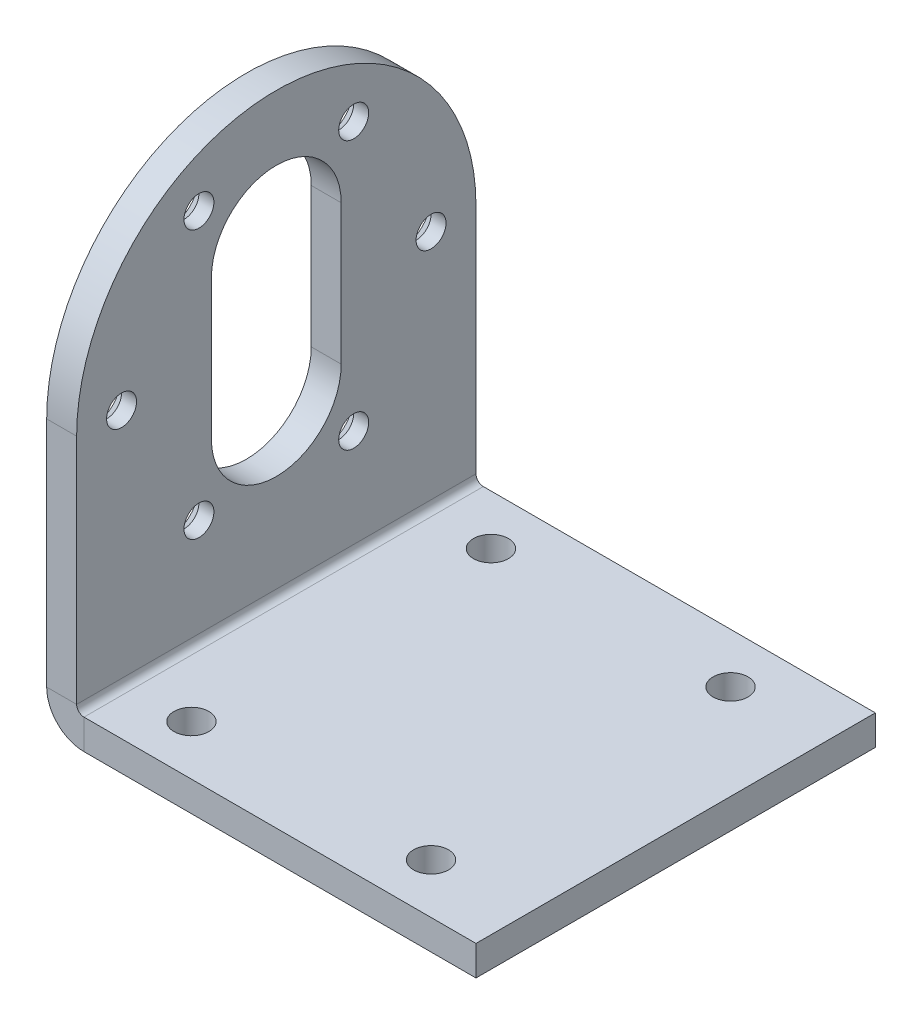
ISO-10303-21;
HEADER;
FILE_DESCRIPTION(('STEP AP214'),'2;1');
FILE_NAME('part.step','',(''),(''),'','','');
FILE_SCHEMA(('AUTOMOTIVE_DESIGN { 1 0 10303 214 1 1 1 1 }'));
ENDSEC;
DATA;
#1=APPLICATION_CONTEXT('core data for automotive mechanical design processes');
#2=APPLICATION_PROTOCOL_DEFINITION('international standard','automotive_design',2000,#1);
#3=PRODUCT_CONTEXT('',#1,'mechanical');
#4=PRODUCT('Part','Part','',(#3));
#5=PRODUCT_RELATED_PRODUCT_CATEGORY('part','',(#4));
#6=PRODUCT_DEFINITION_FORMATION('','',#4);
#7=PRODUCT_DEFINITION_CONTEXT('part definition',#1,'design');
#8=PRODUCT_DEFINITION('design','',#6,#7);
#9=PRODUCT_DEFINITION_SHAPE('','',#8);
#10=(LENGTH_UNIT() NAMED_UNIT(*) SI_UNIT(.MILLI.,.METRE.));
#11=(NAMED_UNIT(*) PLANE_ANGLE_UNIT() SI_UNIT($,.RADIAN.));
#12=(NAMED_UNIT(*) SI_UNIT($,.STERADIAN.) SOLID_ANGLE_UNIT());
#13=UNCERTAINTY_MEASURE_WITH_UNIT(LENGTH_MEASURE(1.E-05),#10,'distance_accuracy_value','');
#14=(GEOMETRIC_REPRESENTATION_CONTEXT(3) GLOBAL_UNCERTAINTY_ASSIGNED_CONTEXT((#13)) GLOBAL_UNIT_ASSIGNED_CONTEXT((#10,
#11,#12)) REPRESENTATION_CONTEXT('',''));
#15=CARTESIAN_POINT('',(0.,0.,0.));
#16=DIRECTION('',(0.,0.,1.));
#17=DIRECTION('',(1.,0.,0.));
#18=AXIS2_PLACEMENT_3D('',#15,#16,#17);
#19=CARTESIAN_POINT('',(-21.5,0.,0.));
#20=DIRECTION('',(1.,0.,0.));
#21=DIRECTION('',(0.,1.,0.));
#22=AXIS2_PLACEMENT_3D('',#19,#20,#21);
#23=PLANE('',#22);
#24=DIRECTION('',(0.,-1.,0.));
#25=VECTOR('',#24,1.);
#26=CARTESIAN_POINT('',(-21.5000000000001,33.9999999999999,-6.5));
#27=LINE('',#26,#25);
#28=CARTESIAN_POINT('',(-21.5000000000001,33.9999999999999,-6.5));
#29=VERTEX_POINT('',#28);
#30=CARTESIAN_POINT('',(-21.5000000000001,19.9999999999999,-6.5));
#31=VERTEX_POINT('',#30);
#32=EDGE_CURVE('E179',#29,#31,#27,.T.);
#33=ORIENTED_EDGE('',*,*,#32,.F.);
#34=CARTESIAN_POINT('',(-21.5000000000001,33.9999999999999,0.));
#35=DIRECTION('',(-1.,0.,0.));
#36=DIRECTION('',(0.,-1.,0.));
#37=AXIS2_PLACEMENT_3D('',#34,#35,#36);
#38=CIRCLE('',#37,6.5);
#39=CARTESIAN_POINT('',(-21.5000000000001,33.9999999999999,6.5));
#40=VERTEX_POINT('',#39);
#41=EDGE_CURVE('E78',#40,#29,#38,.T.);
#42=ORIENTED_EDGE('',*,*,#41,.F.);
#43=DIRECTION('',(0.,-1.,0.));
#44=VECTOR('',#43,1.);
#45=CARTESIAN_POINT('',(-21.5000000000001,33.9999999999999,6.5));
#46=LINE('',#45,#44);
#47=CARTESIAN_POINT('',(-21.5000000000001,19.9999999999999,6.5));
#48=VERTEX_POINT('',#47);
#49=EDGE_CURVE('E170',#40,#48,#46,.T.);
#50=ORIENTED_EDGE('',*,*,#49,.T.);
#51=CARTESIAN_POINT('',(-21.5000000000001,19.9999999999999,0.));
#52=DIRECTION('',(-1.,0.,0.));
#53=DIRECTION('',(0.,-1.,0.));
#54=AXIS2_PLACEMENT_3D('',#51,#52,#53);
#55=CIRCLE('',#54,6.5);
#56=EDGE_CURVE('E173',#31,#48,#55,.T.);
#57=ORIENTED_EDGE('',*,*,#56,.F.);
#58=EDGE_LOOP('',(#33,#42,#50,#57));
#59=FACE_BOUND('',#58,.T.);
#60=CARTESIAN_POINT('',(-21.5000000000001,40.4233937586588,-7.74999999999987));
#61=DIRECTION('',(-1.,0.,0.));
#62=DIRECTION('',(0.,0.,1.));
#63=AXIS2_PLACEMENT_3D('',#60,#61,#62);
#64=CIRCLE('',#63,3.);
#65=CARTESIAN_POINT('',(-21.5000000000001,40.4233937586588,-4.74999999999987));
#66=VERTEX_POINT('',#65);
#67=EDGE_CURVE('E185',#66,#66,#64,.T.);
#68=ORIENTED_EDGE('',*,*,#67,.F.);
#69=EDGE_LOOP('',(#68));
#70=FACE_BOUND('',#69,.T.);
#71=CARTESIAN_POINT('',(-21.5000000000001,40.4233937586586,7.75000000000017));
#72=DIRECTION('',(-1.,0.,0.));
#73=DIRECTION('',(0.,0.,1.));
#74=AXIS2_PLACEMENT_3D('',#71,#72,#73);
#75=CIRCLE('',#74,3.);
#76=CARTESIAN_POINT('',(-21.5000000000001,40.4233937586586,10.7500000000002));
#77=VERTEX_POINT('',#76);
#78=EDGE_CURVE('E194',#77,#77,#75,.T.);
#79=ORIENTED_EDGE('',*,*,#78,.F.);
#80=EDGE_LOOP('',(#79));
#81=FACE_BOUND('',#80,.T.);
#82=CARTESIAN_POINT('',(-21.5000000000001,26.9999999999999,15.5));
#83=DIRECTION('',(-1.,0.,0.));
#84=DIRECTION('',(0.,0.,1.));
#85=AXIS2_PLACEMENT_3D('',#82,#83,#84);
#86=CIRCLE('',#85,3.);
#87=CARTESIAN_POINT('',(-21.5000000000001,26.9999999999999,18.5));
#88=VERTEX_POINT('',#87);
#89=EDGE_CURVE('E201',#88,#88,#86,.T.);
#90=ORIENTED_EDGE('',*,*,#89,.F.);
#91=EDGE_LOOP('',(#90));
#92=FACE_BOUND('',#91,.T.);
#93=CARTESIAN_POINT('',(-21.5,13.5766062413411,7.74999999999997));
#94=DIRECTION('',(-1.,0.,0.));
#95=DIRECTION('',(0.,0.,1.));
#96=AXIS2_PLACEMENT_3D('',#93,#94,#95);
#97=CIRCLE('',#96,3.);
#98=CARTESIAN_POINT('',(-21.5,13.5766062413411,10.75));
#99=VERTEX_POINT('',#98);
#100=EDGE_CURVE('E208',#99,#99,#97,.T.);
#101=ORIENTED_EDGE('',*,*,#100,.F.);
#102=EDGE_LOOP('',(#101));
#103=FACE_BOUND('',#102,.T.);
#104=CARTESIAN_POINT('',(-21.5,13.5766062413412,-7.75000000000007));
#105=DIRECTION('',(-1.,0.,0.));
#106=DIRECTION('',(0.,0.,1.));
#107=AXIS2_PLACEMENT_3D('',#104,#105,#106);
#108=CIRCLE('',#107,3.);
#109=CARTESIAN_POINT('',(-21.5,13.5766062413412,-4.75000000000007));
#110=VERTEX_POINT('',#109);
#111=EDGE_CURVE('E215',#110,#110,#108,.T.);
#112=ORIENTED_EDGE('',*,*,#111,.F.);
#113=EDGE_LOOP('',(#112));
#114=FACE_BOUND('',#113,.T.);
#115=CARTESIAN_POINT('',(-21.5000000000001,27.,-15.5));
#116=DIRECTION('',(-1.,0.,0.));
#117=DIRECTION('',(0.,0.,1.));
#118=AXIS2_PLACEMENT_3D('',#115,#116,#117);
#119=CIRCLE('',#118,3.);
#120=CARTESIAN_POINT('',(-21.5000000000001,27.,-12.5));
#121=VERTEX_POINT('',#120);
#122=EDGE_CURVE('E222',#121,#121,#119,.T.);
#123=ORIENTED_EDGE('',*,*,#122,.F.);
#124=EDGE_LOOP('',(#123));
#125=FACE_BOUND('',#124,.T.);
#126=CARTESIAN_POINT('',(-21.5000000000001,26.9999999999999,0.));
#127=DIRECTION('',(1.,0.,0.));
#128=DIRECTION('',(0.,1.,0.));
#129=AXIS2_PLACEMENT_3D('',#126,#127,#128);
#130=CIRCLE('',#129,20.);
#131=CARTESIAN_POINT('',(-21.5000000000001,26.9999999999999,-20.));
#132=VERTEX_POINT('',#131);
#133=CARTESIAN_POINT('',(-21.5000000000001,26.9999999999999,20.));
#134=VERTEX_POINT('',#133);
#135=EDGE_CURVE('E233',#132,#134,#130,.T.);
#136=ORIENTED_EDGE('',*,*,#135,.F.);
#137=DIRECTION('',(0.,-1.,0.));
#138=VECTOR('',#137,1.);
#139=CARTESIAN_POINT('',(-21.5,0.,-20.));
#140=LINE('',#139,#138);
#141=CARTESIAN_POINT('',(-21.5,3.73659999999999,-20.));
#142=VERTEX_POINT('',#141);
#143=EDGE_CURVE('E240',#132,#142,#140,.T.);
#144=ORIENTED_EDGE('',*,*,#143,.T.);
#145=DIRECTION('',(0.,0.,1.));
#146=VECTOR('',#145,1.);
#147=CARTESIAN_POINT('',(-21.5,3.73659999999999,-20.));
#148=LINE('',#147,#146);
#149=CARTESIAN_POINT('',(-21.5,3.73659999999999,20.));
#150=VERTEX_POINT('',#149);
#151=EDGE_CURVE('E251',#150,#142,#148,.F.);
#152=ORIENTED_EDGE('',*,*,#151,.F.);
#153=DIRECTION('',(0.,1.,0.));
#154=VECTOR('',#153,1.);
#155=CARTESIAN_POINT('',(-21.5,0.,20.));
#156=LINE('',#155,#154);
#157=EDGE_CURVE('E243',#150,#134,#156,.T.);
#158=ORIENTED_EDGE('',*,*,#157,.T.);
#159=EDGE_LOOP('',(#136,#144,#152,#158));
#160=FACE_BOUND('',#159,.T.);
#161=ADVANCED_FACE('F61',(#59,#70,#81,#92,#103,#114,#125,#160),#23,.F.);
#162=CARTESIAN_POINT('',(-18.5,0.,0.));
#163=DIRECTION('',(1.,0.,0.));
#164=DIRECTION('',(0.,1.,0.));
#165=AXIS2_PLACEMENT_3D('',#162,#163,#164);
#166=PLANE('',#165);
#167=CARTESIAN_POINT('',(-18.5000000000001,33.9999999999999,0.));
#168=DIRECTION('',(-1.,0.,0.));
#169=DIRECTION('',(0.,-1.,0.));
#170=AXIS2_PLACEMENT_3D('',#167,#168,#169);
#171=CIRCLE('',#170,6.5);
#172=CARTESIAN_POINT('',(-18.5000000000001,33.9999999999999,6.5));
#173=VERTEX_POINT('',#172);
#174=CARTESIAN_POINT('',(-18.5000000000001,33.9999999999999,-6.5));
#175=VERTEX_POINT('',#174);
#176=EDGE_CURVE('E155',#173,#175,#171,.T.);
#177=ORIENTED_EDGE('',*,*,#176,.T.);
#178=DIRECTION('',(0.,-1.,0.));
#179=VECTOR('',#178,1.);
#180=CARTESIAN_POINT('',(-18.5000000000001,33.9999999999999,-6.5));
#181=LINE('',#180,#179);
#182=CARTESIAN_POINT('',(-18.5000000000001,19.9999999999999,-6.5));
#183=VERTEX_POINT('',#182);
#184=EDGE_CURVE('E164',#175,#183,#181,.T.);
#185=ORIENTED_EDGE('',*,*,#184,.T.);
#186=CARTESIAN_POINT('',(-18.5000000000001,19.9999999999999,0.));
#187=DIRECTION('',(-1.,0.,0.));
#188=DIRECTION('',(0.,-1.,0.));
#189=AXIS2_PLACEMENT_3D('',#186,#187,#188);
#190=CIRCLE('',#189,6.5);
#191=CARTESIAN_POINT('',(-18.5000000000001,19.9999999999999,6.5));
#192=VERTEX_POINT('',#191);
#193=EDGE_CURVE('E86',#183,#192,#190,.T.);
#194=ORIENTED_EDGE('',*,*,#193,.T.);
#195=DIRECTION('',(0.,-1.,0.));
#196=VECTOR('',#195,1.);
#197=CARTESIAN_POINT('',(-18.5000000000001,33.9999999999999,6.5));
#198=LINE('',#197,#196);
#199=EDGE_CURVE('E161',#173,#192,#198,.T.);
#200=ORIENTED_EDGE('',*,*,#199,.F.);
#201=EDGE_LOOP('',(#177,#185,#194,#200));
#202=FACE_BOUND('',#201,.T.);
#203=CARTESIAN_POINT('',(-18.5000000000001,40.4233937586588,-7.74999999999987));
#204=DIRECTION('',(1.,0.,0.));
#205=DIRECTION('',(0.,1.,0.));
#206=AXIS2_PLACEMENT_3D('',#203,#204,#205);
#207=CIRCLE('',#206,1.5);
#208=CARTESIAN_POINT('',(-18.5000000000001,41.9233937586588,-7.74999999999987));
#209=VERTEX_POINT('',#208);
#210=EDGE_CURVE('E65',#209,#209,#207,.T.);
#211=ORIENTED_EDGE('',*,*,#210,.F.);
#212=EDGE_LOOP('',(#211));
#213=FACE_BOUND('',#212,.T.);
#214=CARTESIAN_POINT('',(-18.5000000000001,40.4233937586586,7.75000000000017));
#215=DIRECTION('',(1.,0.,0.));
#216=DIRECTION('',(0.,1.,0.));
#217=AXIS2_PLACEMENT_3D('',#214,#215,#216);
#218=CIRCLE('',#217,1.5);
#219=CARTESIAN_POINT('',(-18.5000000000001,41.9233937586586,7.75000000000017));
#220=VERTEX_POINT('',#219);
#221=EDGE_CURVE('E200',#220,#220,#218,.T.);
#222=ORIENTED_EDGE('',*,*,#221,.F.);
#223=EDGE_LOOP('',(#222));
#224=FACE_BOUND('',#223,.T.);
#225=CARTESIAN_POINT('',(-18.5000000000001,26.9999999999999,15.5));
#226=DIRECTION('',(1.,0.,0.));
#227=DIRECTION('',(0.,1.,0.));
#228=AXIS2_PLACEMENT_3D('',#225,#226,#227);
#229=CIRCLE('',#228,1.5);
#230=CARTESIAN_POINT('',(-18.5000000000001,28.4999999999999,15.5));
#231=VERTEX_POINT('',#230);
#232=EDGE_CURVE('E207',#231,#231,#229,.T.);
#233=ORIENTED_EDGE('',*,*,#232,.F.);
#234=EDGE_LOOP('',(#233));
#235=FACE_BOUND('',#234,.T.);
#236=CARTESIAN_POINT('',(-18.5,13.5766062413411,7.74999999999997));
#237=DIRECTION('',(1.,0.,0.));
#238=DIRECTION('',(0.,1.,0.));
#239=AXIS2_PLACEMENT_3D('',#236,#237,#238);
#240=CIRCLE('',#239,1.5);
#241=CARTESIAN_POINT('',(-18.5,15.0766062413411,7.74999999999997));
#242=VERTEX_POINT('',#241);
#243=EDGE_CURVE('E214',#242,#242,#240,.T.);
#244=ORIENTED_EDGE('',*,*,#243,.F.);
#245=EDGE_LOOP('',(#244));
#246=FACE_BOUND('',#245,.T.);
#247=CARTESIAN_POINT('',(-18.5,13.5766062413412,-7.75000000000007));
#248=DIRECTION('',(1.,0.,0.));
#249=DIRECTION('',(0.,1.,0.));
#250=AXIS2_PLACEMENT_3D('',#247,#248,#249);
#251=CIRCLE('',#250,1.5);
#252=CARTESIAN_POINT('',(-18.5,15.0766062413412,-7.75000000000007));
#253=VERTEX_POINT('',#252);
#254=EDGE_CURVE('E221',#253,#253,#251,.T.);
#255=ORIENTED_EDGE('',*,*,#254,.F.);
#256=EDGE_LOOP('',(#255));
#257=FACE_BOUND('',#256,.T.);
#258=CARTESIAN_POINT('',(-18.5000000000001,27.,-15.5));
#259=DIRECTION('',(1.,0.,0.));
#260=DIRECTION('',(0.,1.,0.));
#261=AXIS2_PLACEMENT_3D('',#258,#259,#260);
#262=CIRCLE('',#261,1.5);
#263=CARTESIAN_POINT('',(-18.5000000000001,28.5,-15.5));
#264=VERTEX_POINT('',#263);
#265=EDGE_CURVE('E228',#264,#264,#262,.T.);
#266=ORIENTED_EDGE('',*,*,#265,.F.);
#267=EDGE_LOOP('',(#266));
#268=FACE_BOUND('',#267,.T.);
#269=DIRECTION('',(0.,1.,0.));
#270=VECTOR('',#269,1.);
#271=CARTESIAN_POINT('',(-18.5,3.,-20.));
#272=LINE('',#271,#270);
#273=CARTESIAN_POINT('',(-18.5000000000001,26.9999999999999,-20.));
#274=VERTEX_POINT('',#273);
#275=CARTESIAN_POINT('',(-18.5,3.7366,-20.));
#276=VERTEX_POINT('',#275);
#277=EDGE_CURVE('E246',#274,#276,#272,.F.);
#278=ORIENTED_EDGE('',*,*,#277,.F.);
#279=CARTESIAN_POINT('',(-18.5000000000001,26.9999999999999,0.));
#280=DIRECTION('',(1.,0.,0.));
#281=DIRECTION('',(0.,1.,0.));
#282=AXIS2_PLACEMENT_3D('',#279,#280,#281);
#283=CIRCLE('',#282,20.);
#284=CARTESIAN_POINT('',(-18.5000000000001,26.9999999999999,20.));
#285=VERTEX_POINT('',#284);
#286=EDGE_CURVE('E232',#274,#285,#283,.T.);
#287=ORIENTED_EDGE('',*,*,#286,.T.);
#288=DIRECTION('',(0.,-1.,0.));
#289=VECTOR('',#288,1.);
#290=CARTESIAN_POINT('',(-18.5000000000002,47.,20.));
#291=LINE('',#290,#289);
#292=CARTESIAN_POINT('',(-18.5,3.7366,20.));
#293=VERTEX_POINT('',#292);
#294=EDGE_CURVE('E248',#293,#285,#291,.F.);
#295=ORIENTED_EDGE('',*,*,#294,.F.);
#296=DIRECTION('',(0.,0.,1.));
#297=VECTOR('',#296,1.);
#298=CARTESIAN_POINT('',(-18.5,3.7366,-20.));
#299=LINE('',#298,#297);
#300=EDGE_CURVE('E257',#276,#293,#299,.T.);
#301=ORIENTED_EDGE('',*,*,#300,.F.);
#302=EDGE_LOOP('',(#278,#287,#295,#301));
#303=FACE_BOUND('',#302,.T.);
#304=ADVANCED_FACE('F168',(#202,#213,#224,#235,#246,#257,#268,#303),#166,.T.);
#305=CARTESIAN_POINT('',(-21.5000000000001,47.,20.));
#306=DIRECTION('',(0.,0.,-1.));
#307=DIRECTION('',(-1.,0.,0.));
#308=AXIS2_PLACEMENT_3D('',#305,#306,#307);
#309=PLANE('',#308);
#310=DIRECTION('',(1.,0.,0.));
#311=VECTOR('',#310,1.);
#312=CARTESIAN_POINT('',(-21.5000000000001,26.9999999999999,20.));
#313=LINE('',#312,#311);
#314=EDGE_CURVE('E235',#134,#285,#313,.T.);
#315=ORIENTED_EDGE('',*,*,#314,.F.);
#316=ORIENTED_EDGE('',*,*,#157,.F.);
#317=DIRECTION('',(1.,0.,0.));
#318=VECTOR('',#317,1.);
#319=CARTESIAN_POINT('',(-18.5,3.7366,20.));
#320=LINE('',#319,#318);
#321=EDGE_CURVE('E254',#293,#150,#320,.F.);
#322=ORIENTED_EDGE('',*,*,#321,.F.);
#323=ORIENTED_EDGE('',*,*,#294,.T.);
#324=EDGE_LOOP('',(#315,#316,#322,#323));
#325=FACE_BOUND('',#324,.T.);
#326=ADVANCED_FACE('F338',(#325),#309,.F.);
#327=CARTESIAN_POINT('',(0.,3.,0.));
#328=DIRECTION('',(0.,1.,0.));
#329=DIRECTION('',(0.,0.,1.));
#330=AXIS2_PLACEMENT_3D('',#327,#328,#329);
#331=PLANE('',#330);
#332=CARTESIAN_POINT('',(-12.,3.,15.));
#333=DIRECTION('',(0.,1.,0.));
#334=DIRECTION('',(0.,0.,1.));
#335=AXIS2_PLACEMENT_3D('',#332,#333,#334);
#336=CIRCLE('',#335,1.75);
#337=CARTESIAN_POINT('',(-12.,3.,16.75));
#338=VERTEX_POINT('',#337);
#339=EDGE_CURVE('E291',#338,#338,#336,.T.);
#340=ORIENTED_EDGE('',*,*,#339,.F.);
#341=EDGE_LOOP('',(#340));
#342=FACE_BOUND('',#341,.T.);
#343=CARTESIAN_POINT('',(-12.,3.,-15.));
#344=DIRECTION('',(0.,1.,0.));
#345=DIRECTION('',(0.,0.,1.));
#346=AXIS2_PLACEMENT_3D('',#343,#344,#345);
#347=CIRCLE('',#346,1.75);
#348=CARTESIAN_POINT('',(-12.,3.,-13.25));
#349=VERTEX_POINT('',#348);
#350=EDGE_CURVE('E303',#349,#349,#347,.T.);
#351=ORIENTED_EDGE('',*,*,#350,.F.);
#352=EDGE_LOOP('',(#351));
#353=FACE_BOUND('',#352,.T.);
#354=CARTESIAN_POINT('',(12.,3.,-15.));
#355=DIRECTION('',(0.,1.,0.));
#356=DIRECTION('',(0.,0.,1.));
#357=AXIS2_PLACEMENT_3D('',#354,#355,#356);
#358=CIRCLE('',#357,1.75);
#359=CARTESIAN_POINT('',(12.,3.,-13.25));
#360=VERTEX_POINT('',#359);
#361=EDGE_CURVE('E297',#360,#360,#358,.T.);
#362=ORIENTED_EDGE('',*,*,#361,.F.);
#363=EDGE_LOOP('',(#362));
#364=FACE_BOUND('',#363,.T.);
#365=CARTESIAN_POINT('',(12.,3.,15.));
#366=DIRECTION('',(0.,1.,0.));
#367=DIRECTION('',(0.,0.,1.));
#368=AXIS2_PLACEMENT_3D('',#365,#366,#367);
#369=CIRCLE('',#368,1.75);
#370=CARTESIAN_POINT('',(12.,3.,16.75));
#371=VERTEX_POINT('',#370);
#372=EDGE_CURVE('E285',#371,#371,#369,.T.);
#373=ORIENTED_EDGE('',*,*,#372,.F.);
#374=EDGE_LOOP('',(#373));
#375=FACE_BOUND('',#374,.T.);
#376=DIRECTION('',(-1.,0.,0.));
#377=VECTOR('',#376,1.);
#378=CARTESIAN_POINT('',(-21.5,3.,-20.));
#379=LINE('',#378,#377);
#380=CARTESIAN_POINT('',(21.5,3.,-20.));
#381=VERTEX_POINT('',#380);
#382=CARTESIAN_POINT('',(-17.7634,3.,-20.));
#383=VERTEX_POINT('',#382);
#384=EDGE_CURVE('E314',#381,#383,#379,.T.);
#385=ORIENTED_EDGE('',*,*,#384,.T.);
#386=DIRECTION('',(0.,0.,1.));
#387=VECTOR('',#386,1.);
#388=CARTESIAN_POINT('',(-17.7634,3.,20.));
#389=LINE('',#388,#387);
#390=CARTESIAN_POINT('',(-17.7634,3.,20.));
#391=VERTEX_POINT('',#390);
#392=EDGE_CURVE('E274',#391,#383,#389,.F.);
#393=ORIENTED_EDGE('',*,*,#392,.F.);
#394=DIRECTION('',(1.,0.,0.));
#395=VECTOR('',#394,1.);
#396=CARTESIAN_POINT('',(-21.5,3.,20.));
#397=LINE('',#396,#395);
#398=CARTESIAN_POINT('',(21.5,3.,20.));
#399=VERTEX_POINT('',#398);
#400=EDGE_CURVE('E309',#391,#399,#397,.T.);
#401=ORIENTED_EDGE('',*,*,#400,.T.);
#402=DIRECTION('',(0.,0.,-1.));
#403=VECTOR('',#402,1.);
#404=CARTESIAN_POINT('',(21.5,3.,-20.));
#405=LINE('',#404,#403);
#406=EDGE_CURVE('E311',#399,#381,#405,.T.);
#407=ORIENTED_EDGE('',*,*,#406,.T.);
#408=EDGE_LOOP('',(#385,#393,#401,#407));
#409=FACE_BOUND('',#408,.T.);
#410=ADVANCED_FACE('F365',(#342,#353,#364,#375,#409),#331,.T.);
#411=CARTESIAN_POINT('',(0.,0.,0.));
#412=DIRECTION('',(0.,1.,0.));
#413=DIRECTION('',(0.,0.,1.));
#414=AXIS2_PLACEMENT_3D('',#411,#412,#413);
#415=PLANE('',#414);
#416=CARTESIAN_POINT('',(12.,0.,15.));
#417=DIRECTION('',(0.,1.,0.));
#418=DIRECTION('',(0.,0.,1.));
#419=AXIS2_PLACEMENT_3D('',#416,#417,#418);
#420=CIRCLE('',#419,1.75);
#421=CARTESIAN_POINT('',(12.,0.,16.75));
#422=VERTEX_POINT('',#421);
#423=EDGE_CURVE('E282',#422,#422,#420,.T.);
#424=ORIENTED_EDGE('',*,*,#423,.T.);
#425=EDGE_LOOP('',(#424));
#426=FACE_BOUND('',#425,.T.);
#427=CARTESIAN_POINT('',(-12.,0.,15.));
#428=DIRECTION('',(0.,1.,0.));
#429=DIRECTION('',(0.,0.,1.));
#430=AXIS2_PLACEMENT_3D('',#427,#428,#429);
#431=CIRCLE('',#430,1.75);
#432=CARTESIAN_POINT('',(-12.,0.,16.75));
#433=VERTEX_POINT('',#432);
#434=EDGE_CURVE('E288',#433,#433,#431,.T.);
#435=ORIENTED_EDGE('',*,*,#434,.T.);
#436=EDGE_LOOP('',(#435));
#437=FACE_BOUND('',#436,.T.);
#438=CARTESIAN_POINT('',(12.,0.,-15.));
#439=DIRECTION('',(0.,1.,0.));
#440=DIRECTION('',(0.,0.,1.));
#441=AXIS2_PLACEMENT_3D('',#438,#439,#440);
#442=CIRCLE('',#441,1.75);
#443=CARTESIAN_POINT('',(12.,0.,-13.25));
#444=VERTEX_POINT('',#443);
#445=EDGE_CURVE('E294',#444,#444,#442,.T.);
#446=ORIENTED_EDGE('',*,*,#445,.T.);
#447=EDGE_LOOP('',(#446));
#448=FACE_BOUND('',#447,.T.);
#449=CARTESIAN_POINT('',(-12.,0.,-15.));
#450=DIRECTION('',(0.,1.,0.));
#451=DIRECTION('',(0.,0.,1.));
#452=AXIS2_PLACEMENT_3D('',#449,#450,#451);
#453=CIRCLE('',#452,1.75);
#454=CARTESIAN_POINT('',(-12.,0.,-13.25));
#455=VERTEX_POINT('',#454);
#456=EDGE_CURVE('E300',#455,#455,#453,.T.);
#457=ORIENTED_EDGE('',*,*,#456,.T.);
#458=EDGE_LOOP('',(#457));
#459=FACE_BOUND('',#458,.T.);
#460=DIRECTION('',(0.,0.,1.));
#461=VECTOR('',#460,1.);
#462=CARTESIAN_POINT('',(-17.7634,0.,20.));
#463=LINE('',#462,#461);
#464=CARTESIAN_POINT('',(-17.7634,0.,20.));
#465=VERTEX_POINT('',#464);
#466=CARTESIAN_POINT('',(-17.7634,0.,-20.));
#467=VERTEX_POINT('',#466);
#468=EDGE_CURVE('E261',#465,#467,#463,.F.);
#469=ORIENTED_EDGE('',*,*,#468,.T.);
#470=DIRECTION('',(-1.,0.,0.));
#471=VECTOR('',#470,1.);
#472=CARTESIAN_POINT('',(-21.5,0.,-20.));
#473=LINE('',#472,#471);
#474=CARTESIAN_POINT('',(21.5,0.,-20.));
#475=VERTEX_POINT('',#474);
#476=EDGE_CURVE('E312',#475,#467,#473,.T.);
#477=ORIENTED_EDGE('',*,*,#476,.F.);
#478=DIRECTION('',(0.,0.,-1.));
#479=VECTOR('',#478,1.);
#480=CARTESIAN_POINT('',(21.5,0.,-20.));
#481=LINE('',#480,#479);
#482=CARTESIAN_POINT('',(21.5,0.,20.));
#483=VERTEX_POINT('',#482);
#484=EDGE_CURVE('E318',#483,#475,#481,.T.);
#485=ORIENTED_EDGE('',*,*,#484,.F.);
#486=DIRECTION('',(1.,0.,0.));
#487=VECTOR('',#486,1.);
#488=CARTESIAN_POINT('',(-21.5,0.,20.));
#489=LINE('',#488,#487);
#490=EDGE_CURVE('E306',#465,#483,#489,.T.);
#491=ORIENTED_EDGE('',*,*,#490,.F.);
#492=EDGE_LOOP('',(#469,#477,#485,#491));
#493=FACE_BOUND('',#492,.T.);
#494=ADVANCED_FACE('F380',(#426,#437,#448,#459,#493),#415,.F.);
#495=CARTESIAN_POINT('',(-21.5,3.,20.));
#496=DIRECTION('',(0.,0.,-1.));
#497=DIRECTION('',(-1.,0.,0.));
#498=AXIS2_PLACEMENT_3D('',#495,#496,#497);
#499=PLANE('',#498);
#500=DIRECTION('',(0.,-1.,0.));
#501=VECTOR('',#500,1.);
#502=CARTESIAN_POINT('',(-17.7634,3.,20.));
#503=LINE('',#502,#501);
#504=EDGE_CURVE('E268',#391,#465,#503,.T.);
#505=ORIENTED_EDGE('',*,*,#504,.T.);
#506=ORIENTED_EDGE('',*,*,#490,.T.);
#507=DIRECTION('',(0.,-1.,0.));
#508=VECTOR('',#507,1.);
#509=CARTESIAN_POINT('',(21.5,3.,20.));
#510=LINE('',#509,#508);
#511=EDGE_CURVE('E13',#399,#483,#510,.T.);
#512=ORIENTED_EDGE('',*,*,#511,.F.);
#513=ORIENTED_EDGE('',*,*,#400,.F.);
#514=EDGE_LOOP('',(#505,#506,#512,#513));
#515=FACE_BOUND('',#514,.T.);
#516=ADVANCED_FACE('F63',(#515),#499,.F.);
#517=CARTESIAN_POINT('',(-21.5,3.,-20.));
#518=DIRECTION('',(0.,0.,1.));
#519=DIRECTION('',(1.,0.,0.));
#520=AXIS2_PLACEMENT_3D('',#517,#518,#519);
#521=PLANE('',#520);
#522=DIRECTION('',(0.,-1.,0.));
#523=VECTOR('',#522,1.);
#524=CARTESIAN_POINT('',(-17.7634,3.,-20.));
#525=LINE('',#524,#523);
#526=EDGE_CURVE('E279',#383,#467,#525,.T.);
#527=ORIENTED_EDGE('',*,*,#526,.F.);
#528=ORIENTED_EDGE('',*,*,#384,.F.);
#529=DIRECTION('',(0.,-1.,0.));
#530=VECTOR('',#529,1.);
#531=CARTESIAN_POINT('',(21.5,3.,-20.));
#532=LINE('',#531,#530);
#533=EDGE_CURVE('E70',#381,#475,#532,.T.);
#534=ORIENTED_EDGE('',*,*,#533,.T.);
#535=ORIENTED_EDGE('',*,*,#476,.T.);
#536=EDGE_LOOP('',(#527,#528,#534,#535));
#537=FACE_BOUND('',#536,.T.);
#538=ADVANCED_FACE('F383',(#537),#521,.F.);
#539=CARTESIAN_POINT('',(21.5,3.,-20.));
#540=DIRECTION('',(-1.,0.,0.));
#541=DIRECTION('',(0.,0.,1.));
#542=AXIS2_PLACEMENT_3D('',#539,#540,#541);
#543=PLANE('',#542);
#544=ORIENTED_EDGE('',*,*,#484,.T.);
#545=ORIENTED_EDGE('',*,*,#533,.F.);
#546=ORIENTED_EDGE('',*,*,#406,.F.);
#547=ORIENTED_EDGE('',*,*,#511,.T.);
#548=EDGE_LOOP('',(#544,#545,#546,#547));
#549=FACE_BOUND('',#548,.T.);
#550=ADVANCED_FACE('F386',(#549),#543,.F.);
#551=CARTESIAN_POINT('',(-12.,3.,-15.));
#552=DIRECTION('',(0.,-1.,0.));
#553=DIRECTION('',(0.,0.,-1.));
#554=AXIS2_PLACEMENT_3D('',#551,#552,#553);
#555=CYLINDRICAL_SURFACE('',#554,1.75);
#556=ORIENTED_EDGE('',*,*,#350,.T.);
#557=EDGE_LOOP('',(#556));
#558=FACE_BOUND('',#557,.T.);
#559=ORIENTED_EDGE('',*,*,#456,.F.);
#560=EDGE_LOOP('',(#559));
#561=FACE_BOUND('',#560,.T.);
#562=ADVANCED_FACE('F388',(#558,#561),#555,.F.);
#563=CARTESIAN_POINT('',(12.,3.,-15.));
#564=DIRECTION('',(0.,-1.,0.));
#565=DIRECTION('',(0.,0.,-1.));
#566=AXIS2_PLACEMENT_3D('',#563,#564,#565);
#567=CYLINDRICAL_SURFACE('',#566,1.75);
#568=ORIENTED_EDGE('',*,*,#361,.T.);
#569=EDGE_LOOP('',(#568));
#570=FACE_BOUND('',#569,.T.);
#571=ORIENTED_EDGE('',*,*,#445,.F.);
#572=EDGE_LOOP('',(#571));
#573=FACE_BOUND('',#572,.T.);
#574=ADVANCED_FACE('F393',(#570,#573),#567,.F.);
#575=CARTESIAN_POINT('',(-12.,3.,15.));
#576=DIRECTION('',(0.,-1.,0.));
#577=DIRECTION('',(0.,0.,-1.));
#578=AXIS2_PLACEMENT_3D('',#575,#576,#577);
#579=CYLINDRICAL_SURFACE('',#578,1.75);
#580=ORIENTED_EDGE('',*,*,#339,.T.);
#581=EDGE_LOOP('',(#580));
#582=FACE_BOUND('',#581,.T.);
#583=ORIENTED_EDGE('',*,*,#434,.F.);
#584=EDGE_LOOP('',(#583));
#585=FACE_BOUND('',#584,.T.);
#586=ADVANCED_FACE('F423',(#582,#585),#579,.F.);
#587=CARTESIAN_POINT('',(12.,3.,15.));
#588=DIRECTION('',(0.,-1.,0.));
#589=DIRECTION('',(0.,0.,-1.));
#590=AXIS2_PLACEMENT_3D('',#587,#588,#589);
#591=CYLINDRICAL_SURFACE('',#590,1.75);
#592=ORIENTED_EDGE('',*,*,#372,.T.);
#593=EDGE_LOOP('',(#592));
#594=FACE_BOUND('',#593,.T.);
#595=ORIENTED_EDGE('',*,*,#423,.F.);
#596=EDGE_LOOP('',(#595));
#597=FACE_BOUND('',#596,.T.);
#598=ADVANCED_FACE('F418',(#594,#597),#591,.F.);
#599=CARTESIAN_POINT('',(-17.7634,3.7366,-20.));
#600=DIRECTION('',(0.,0.,-1.));
#601=DIRECTION('',(-1.,0.,0.));
#602=AXIS2_PLACEMENT_3D('',#599,#600,#601);
#603=PLANE('',#602);
#604=DIRECTION('',(1.,0.,0.));
#605=VECTOR('',#604,1.);
#606=CARTESIAN_POINT('',(-21.5,3.73659999999999,-20.));
#607=LINE('',#606,#605);
#608=EDGE_CURVE('E239',#276,#142,#607,.F.);
#609=ORIENTED_EDGE('',*,*,#608,.F.);
#610=CARTESIAN_POINT('',(-17.7634,3.7366,-20.));
#611=DIRECTION('',(0.,0.,1.));
#612=DIRECTION('',(1.,0.,0.));
#613=AXIS2_PLACEMENT_3D('',#610,#611,#612);
#614=CIRCLE('',#613,0.7366);
#615=EDGE_CURVE('E271',#383,#276,#614,.F.);
#616=ORIENTED_EDGE('',*,*,#615,.F.);
#617=ORIENTED_EDGE('',*,*,#526,.T.);
#618=CARTESIAN_POINT('',(-17.7634,3.7366,-20.));
#619=DIRECTION('',(0.,0.,1.));
#620=DIRECTION('',(1.,0.,0.));
#621=AXIS2_PLACEMENT_3D('',#618,#619,#620);
#622=CIRCLE('',#621,3.7366);
#623=EDGE_CURVE('E264',#467,#142,#622,.F.);
#624=ORIENTED_EDGE('',*,*,#623,.T.);
#625=EDGE_LOOP('',(#609,#616,#617,#624));
#626=FACE_BOUND('',#625,.T.);
#627=ADVANCED_FACE('F358',(#626),#603,.T.);
#628=CARTESIAN_POINT('',(-17.7634,3.7366,20.));
#629=DIRECTION('',(0.,0.,-1.));
#630=DIRECTION('',(-1.,0.,0.));
#631=AXIS2_PLACEMENT_3D('',#628,#629,#630);
#632=PLANE('',#631);
#633=CARTESIAN_POINT('',(-17.7634,3.7366,20.));
#634=DIRECTION('',(0.,0.,1.));
#635=DIRECTION('',(1.,0.,0.));
#636=AXIS2_PLACEMENT_3D('',#633,#634,#635);
#637=CIRCLE('',#636,0.7366);
#638=EDGE_CURVE('E242',#293,#391,#637,.T.);
#639=ORIENTED_EDGE('',*,*,#638,.F.);
#640=ORIENTED_EDGE('',*,*,#321,.T.);
#641=CARTESIAN_POINT('',(-17.7634,3.7366,20.));
#642=DIRECTION('',(0.,0.,1.));
#643=DIRECTION('',(1.,0.,0.));
#644=AXIS2_PLACEMENT_3D('',#641,#642,#643);
#645=CIRCLE('',#644,3.7366);
#646=EDGE_CURVE('E265',#150,#465,#645,.T.);
#647=ORIENTED_EDGE('',*,*,#646,.T.);
#648=ORIENTED_EDGE('',*,*,#504,.F.);
#649=EDGE_LOOP('',(#639,#640,#647,#648));
#650=FACE_BOUND('',#649,.T.);
#651=ADVANCED_FACE('F373',(#650),#632,.F.);
#652=CARTESIAN_POINT('',(-17.7634,3.7366,20.));
#653=DIRECTION('',(0.,0.,1.));
#654=DIRECTION('',(-1.,0.,0.));
#655=AXIS2_PLACEMENT_3D('',#652,#653,#654);
#656=CYLINDRICAL_SURFACE('',#655,3.7366);
#657=ORIENTED_EDGE('',*,*,#468,.F.);
#658=ORIENTED_EDGE('',*,*,#646,.F.);
#659=ORIENTED_EDGE('',*,*,#151,.T.);
#660=ORIENTED_EDGE('',*,*,#623,.F.);
#661=EDGE_LOOP('',(#657,#658,#659,#660));
#662=FACE_BOUND('',#661,.T.);
#663=ADVANCED_FACE('F377',(#662),#656,.T.);
#664=CARTESIAN_POINT('',(-17.7634,3.7366,20.));
#665=DIRECTION('',(0.,0.,1.));
#666=DIRECTION('',(-1.,0.,0.));
#667=AXIS2_PLACEMENT_3D('',#664,#665,#666);
#668=CYLINDRICAL_SURFACE('',#667,0.7366);
#669=ORIENTED_EDGE('',*,*,#392,.T.);
#670=ORIENTED_EDGE('',*,*,#615,.T.);
#671=ORIENTED_EDGE('',*,*,#300,.T.);
#672=ORIENTED_EDGE('',*,*,#638,.T.);
#673=EDGE_LOOP('',(#669,#670,#671,#672));
#674=FACE_BOUND('',#673,.T.);
#675=ADVANCED_FACE('F361',(#674),#668,.F.);
#676=CARTESIAN_POINT('',(-21.5,2.99999999999999,-20.));
#677=DIRECTION('',(0.,0.,1.));
#678=DIRECTION('',(1.,0.,0.));
#679=AXIS2_PLACEMENT_3D('',#676,#677,#678);
#680=PLANE('',#679);
#681=ORIENTED_EDGE('',*,*,#143,.F.);
#682=DIRECTION('',(1.,0.,0.));
#683=VECTOR('',#682,1.);
#684=CARTESIAN_POINT('',(-21.5000000000001,26.9999999999999,-20.));
#685=LINE('',#684,#683);
#686=EDGE_CURVE('E229',#132,#274,#685,.T.);
#687=ORIENTED_EDGE('',*,*,#686,.T.);
#688=ORIENTED_EDGE('',*,*,#277,.T.);
#689=ORIENTED_EDGE('',*,*,#608,.T.);
#690=EDGE_LOOP('',(#681,#687,#688,#689));
#691=FACE_BOUND('',#690,.T.);
#692=ADVANCED_FACE('F354',(#691),#680,.F.);
#693=CARTESIAN_POINT('',(-21.5000000000001,26.9999999999999,0.));
#694=DIRECTION('',(1.,0.,0.));
#695=DIRECTION('',(0.,1.,0.));
#696=AXIS2_PLACEMENT_3D('',#693,#694,#695);
#697=CYLINDRICAL_SURFACE('',#696,20.);
#698=ORIENTED_EDGE('',*,*,#286,.F.);
#699=ORIENTED_EDGE('',*,*,#686,.F.);
#700=ORIENTED_EDGE('',*,*,#135,.T.);
#701=ORIENTED_EDGE('',*,*,#314,.T.);
#702=EDGE_LOOP('',(#698,#699,#700,#701));
#703=FACE_BOUND('',#702,.T.);
#704=ADVANCED_FACE('F404',(#703),#697,.T.);
#705=CARTESIAN_POINT('',(-21.5000000000001,27.,-15.5));
#706=DIRECTION('',(-1.,0.,0.));
#707=DIRECTION('',(0.,0.,1.));
#708=AXIS2_PLACEMENT_3D('',#705,#706,#707);
#709=CYLINDRICAL_SURFACE('',#708,1.5);
#710=ORIENTED_EDGE('',*,*,#265,.T.);
#711=EDGE_LOOP('',(#710));
#712=FACE_BOUND('',#711,.T.);
#713=CARTESIAN_POINT('',(-20.0000000000001,27.,-15.5));
#714=DIRECTION('',(-1.,0.,0.));
#715=DIRECTION('',(0.,0.,1.));
#716=AXIS2_PLACEMENT_3D('',#713,#714,#715);
#717=CIRCLE('',#716,1.5);
#718=CARTESIAN_POINT('',(-20.0000000000001,27.,-14.));
#719=VERTEX_POINT('',#718);
#720=EDGE_CURVE('E225',#719,#719,#717,.T.);
#721=ORIENTED_EDGE('',*,*,#720,.T.);
#722=EDGE_LOOP('',(#721));
#723=FACE_BOUND('',#722,.T.);
#724=ADVANCED_FACE('F511',(#712,#723),#709,.F.);
#725=CARTESIAN_POINT('',(-21.5000000000001,27.,-15.5));
#726=DIRECTION('',(-1.,0.,0.));
#727=DIRECTION('',(0.,0.,1.));
#728=AXIS2_PLACEMENT_3D('',#725,#726,#727);
#729=CONICAL_SURFACE('',#728,3.,0.785398163397447);
#730=ORIENTED_EDGE('',*,*,#720,.F.);
#731=EDGE_LOOP('',(#730));
#732=FACE_BOUND('',#731,.T.);
#733=ORIENTED_EDGE('',*,*,#122,.T.);
#734=EDGE_LOOP('',(#733));
#735=FACE_BOUND('',#734,.T.);
#736=ADVANCED_FACE('F521',(#732,#735),#729,.F.);
#737=CARTESIAN_POINT('',(-21.5,13.5766062413412,-7.75000000000007));
#738=DIRECTION('',(-1.,0.,0.));
#739=DIRECTION('',(0.,0.,1.));
#740=AXIS2_PLACEMENT_3D('',#737,#738,#739);
#741=CYLINDRICAL_SURFACE('',#740,1.5);
#742=ORIENTED_EDGE('',*,*,#254,.T.);
#743=EDGE_LOOP('',(#742));
#744=FACE_BOUND('',#743,.T.);
#745=CARTESIAN_POINT('',(-20.,13.5766062413412,-7.75000000000007));
#746=DIRECTION('',(-1.,0.,0.));
#747=DIRECTION('',(0.,0.,1.));
#748=AXIS2_PLACEMENT_3D('',#745,#746,#747);
#749=CIRCLE('',#748,1.5);
#750=CARTESIAN_POINT('',(-20.,13.5766062413412,-6.25000000000007));
#751=VERTEX_POINT('',#750);
#752=EDGE_CURVE('E218',#751,#751,#749,.T.);
#753=ORIENTED_EDGE('',*,*,#752,.T.);
#754=EDGE_LOOP('',(#753));
#755=FACE_BOUND('',#754,.T.);
#756=ADVANCED_FACE('F531',(#744,#755),#741,.F.);
#757=CARTESIAN_POINT('',(-21.5,13.5766062413412,-7.75000000000007));
#758=DIRECTION('',(-1.,0.,0.));
#759=DIRECTION('',(0.,0.,1.));
#760=AXIS2_PLACEMENT_3D('',#757,#758,#759);
#761=CONICAL_SURFACE('',#760,3.,0.78539816339745);
#762=ORIENTED_EDGE('',*,*,#752,.F.);
#763=EDGE_LOOP('',(#762));
#764=FACE_BOUND('',#763,.T.);
#765=ORIENTED_EDGE('',*,*,#111,.T.);
#766=EDGE_LOOP('',(#765));
#767=FACE_BOUND('',#766,.T.);
#768=ADVANCED_FACE('F542',(#764,#767),#761,.F.);
#769=CARTESIAN_POINT('',(-21.5,13.5766062413411,7.74999999999997));
#770=DIRECTION('',(-1.,0.,0.));
#771=DIRECTION('',(0.,0.,1.));
#772=AXIS2_PLACEMENT_3D('',#769,#770,#771);
#773=CYLINDRICAL_SURFACE('',#772,1.5);
#774=ORIENTED_EDGE('',*,*,#243,.T.);
#775=EDGE_LOOP('',(#774));
#776=FACE_BOUND('',#775,.T.);
#777=CARTESIAN_POINT('',(-20.,13.5766062413411,7.74999999999997));
#778=DIRECTION('',(-1.,0.,0.));
#779=DIRECTION('',(0.,0.,1.));
#780=AXIS2_PLACEMENT_3D('',#777,#778,#779);
#781=CIRCLE('',#780,1.5);
#782=CARTESIAN_POINT('',(-20.,13.5766062413411,9.24999999999997));
#783=VERTEX_POINT('',#782);
#784=EDGE_CURVE('E211',#783,#783,#781,.T.);
#785=ORIENTED_EDGE('',*,*,#784,.T.);
#786=EDGE_LOOP('',(#785));
#787=FACE_BOUND('',#786,.T.);
#788=ADVANCED_FACE('F553',(#776,#787),#773,.F.);
#789=CARTESIAN_POINT('',(-21.5,13.5766062413411,7.74999999999997));
#790=DIRECTION('',(-1.,0.,0.));
#791=DIRECTION('',(0.,0.,1.));
#792=AXIS2_PLACEMENT_3D('',#789,#790,#791);
#793=CONICAL_SURFACE('',#792,3.,0.785398163397449);
#794=ORIENTED_EDGE('',*,*,#784,.F.);
#795=EDGE_LOOP('',(#794));
#796=FACE_BOUND('',#795,.T.);
#797=ORIENTED_EDGE('',*,*,#100,.T.);
#798=EDGE_LOOP('',(#797));
#799=FACE_BOUND('',#798,.T.);
#800=ADVANCED_FACE('F564',(#796,#799),#793,.F.);
#801=CARTESIAN_POINT('',(-21.5000000000001,26.9999999999999,15.5));
#802=DIRECTION('',(-1.,0.,0.));
#803=DIRECTION('',(0.,0.,1.));
#804=AXIS2_PLACEMENT_3D('',#801,#802,#803);
#805=CYLINDRICAL_SURFACE('',#804,1.5);
#806=ORIENTED_EDGE('',*,*,#232,.T.);
#807=EDGE_LOOP('',(#806));
#808=FACE_BOUND('',#807,.T.);
#809=CARTESIAN_POINT('',(-20.0000000000001,26.9999999999999,15.5));
#810=DIRECTION('',(-1.,0.,0.));
#811=DIRECTION('',(0.,0.,1.));
#812=AXIS2_PLACEMENT_3D('',#809,#810,#811);
#813=CIRCLE('',#812,1.5);
#814=CARTESIAN_POINT('',(-20.0000000000001,26.9999999999999,17.));
#815=VERTEX_POINT('',#814);
#816=EDGE_CURVE('E204',#815,#815,#813,.T.);
#817=ORIENTED_EDGE('',*,*,#816,.T.);
#818=EDGE_LOOP('',(#817));
#819=FACE_BOUND('',#818,.T.);
#820=ADVANCED_FACE('F575',(#808,#819),#805,.F.);
#821=CARTESIAN_POINT('',(-21.5000000000001,26.9999999999999,15.5));
#822=DIRECTION('',(-1.,0.,0.));
#823=DIRECTION('',(0.,0.,1.));
#824=AXIS2_PLACEMENT_3D('',#821,#822,#823);
#825=CONICAL_SURFACE('',#824,3.,0.785398163397447);
#826=ORIENTED_EDGE('',*,*,#816,.F.);
#827=EDGE_LOOP('',(#826));
#828=FACE_BOUND('',#827,.T.);
#829=ORIENTED_EDGE('',*,*,#89,.T.);
#830=EDGE_LOOP('',(#829));
#831=FACE_BOUND('',#830,.T.);
#832=ADVANCED_FACE('F586',(#828,#831),#825,.F.);
#833=CARTESIAN_POINT('',(-21.5000000000001,40.4233937586586,7.75000000000017));
#834=DIRECTION('',(-1.,0.,0.));
#835=DIRECTION('',(0.,0.,1.));
#836=AXIS2_PLACEMENT_3D('',#833,#834,#835);
#837=CYLINDRICAL_SURFACE('',#836,1.5);
#838=ORIENTED_EDGE('',*,*,#221,.T.);
#839=EDGE_LOOP('',(#838));
#840=FACE_BOUND('',#839,.T.);
#841=CARTESIAN_POINT('',(-20.0000000000001,40.4233937586586,7.75000000000017));
#842=DIRECTION('',(-1.,0.,0.));
#843=DIRECTION('',(0.,0.,1.));
#844=AXIS2_PLACEMENT_3D('',#841,#842,#843);
#845=CIRCLE('',#844,1.5);
#846=CARTESIAN_POINT('',(-20.0000000000001,40.4233937586586,9.25000000000017));
#847=VERTEX_POINT('',#846);
#848=EDGE_CURVE('E197',#847,#847,#845,.T.);
#849=ORIENTED_EDGE('',*,*,#848,.T.);
#850=EDGE_LOOP('',(#849));
#851=FACE_BOUND('',#850,.T.);
#852=ADVANCED_FACE('F333',(#840,#851),#837,.F.);
#853=CARTESIAN_POINT('',(-21.5000000000001,40.4233937586586,7.75000000000017));
#854=DIRECTION('',(-1.,0.,0.));
#855=DIRECTION('',(0.,0.,1.));
#856=AXIS2_PLACEMENT_3D('',#853,#854,#855);
#857=CONICAL_SURFACE('',#856,3.,0.78539816339745);
#858=ORIENTED_EDGE('',*,*,#848,.F.);
#859=EDGE_LOOP('',(#858));
#860=FACE_BOUND('',#859,.T.);
#861=ORIENTED_EDGE('',*,*,#78,.T.);
#862=EDGE_LOOP('',(#861));
#863=FACE_BOUND('',#862,.T.);
#864=ADVANCED_FACE('F607',(#860,#863),#857,.F.);
#865=CARTESIAN_POINT('',(-21.5000000000001,40.4233937586588,-7.74999999999987));
#866=DIRECTION('',(-1.,0.,0.));
#867=DIRECTION('',(0.,0.,1.));
#868=AXIS2_PLACEMENT_3D('',#865,#866,#867);
#869=CYLINDRICAL_SURFACE('',#868,1.5);
#870=ORIENTED_EDGE('',*,*,#210,.T.);
#871=EDGE_LOOP('',(#870));
#872=FACE_BOUND('',#871,.T.);
#873=CARTESIAN_POINT('',(-20.0000000000001,40.4233937586588,-7.74999999999987));
#874=DIRECTION('',(-1.,0.,0.));
#875=DIRECTION('',(0.,0.,1.));
#876=AXIS2_PLACEMENT_3D('',#873,#874,#875);
#877=CIRCLE('',#876,1.5);
#878=CARTESIAN_POINT('',(-20.0000000000001,40.4233937586588,-6.24999999999987));
#879=VERTEX_POINT('',#878);
#880=EDGE_CURVE('E191',#879,#879,#877,.T.);
#881=ORIENTED_EDGE('',*,*,#880,.T.);
#882=EDGE_LOOP('',(#881));
#883=FACE_BOUND('',#882,.T.);
#884=ADVANCED_FACE('F617',(#872,#883),#869,.F.);
#885=CARTESIAN_POINT('',(-21.5000000000001,40.4233937586588,-7.74999999999987));
#886=DIRECTION('',(-1.,0.,0.));
#887=DIRECTION('',(0.,0.,1.));
#888=AXIS2_PLACEMENT_3D('',#885,#886,#887);
#889=CONICAL_SURFACE('',#888,3.,0.78539816339745);
#890=ORIENTED_EDGE('',*,*,#880,.F.);
#891=EDGE_LOOP('',(#890));
#892=FACE_BOUND('',#891,.T.);
#893=ORIENTED_EDGE('',*,*,#67,.T.);
#894=EDGE_LOOP('',(#893));
#895=FACE_BOUND('',#894,.T.);
#896=ADVANCED_FACE('F628',(#892,#895),#889,.F.);
#897=CARTESIAN_POINT('',(-18.5000000000001,33.9999999999999,0.));
#898=DIRECTION('',(-1.,0.,0.));
#899=DIRECTION('',(0.,-1.,0.));
#900=AXIS2_PLACEMENT_3D('',#897,#898,#899);
#901=CYLINDRICAL_SURFACE('',#900,6.5);
#902=ORIENTED_EDGE('',*,*,#41,.T.);
#903=DIRECTION('',(-1.,0.,0.));
#904=VECTOR('',#903,1.);
#905=CARTESIAN_POINT('',(-18.5000000000001,33.9999999999999,-6.5));
#906=LINE('',#905,#904);
#907=EDGE_CURVE('E151',#175,#29,#906,.T.);
#908=ORIENTED_EDGE('',*,*,#907,.F.);
#909=ORIENTED_EDGE('',*,*,#176,.F.);
#910=DIRECTION('',(-1.,0.,0.));
#911=VECTOR('',#910,1.);
#912=CARTESIAN_POINT('',(-18.5000000000001,33.9999999999999,6.5));
#913=LINE('',#912,#911);
#914=EDGE_CURVE('E183',#173,#40,#913,.T.);
#915=ORIENTED_EDGE('',*,*,#914,.T.);
#916=EDGE_LOOP('',(#902,#908,#909,#915));
#917=FACE_BOUND('',#916,.T.);
#918=ADVANCED_FACE('F153',(#917),#901,.F.);
#919=CARTESIAN_POINT('',(-18.5000000000001,33.9999999999999,6.5));
#920=DIRECTION('',(0.,0.,-1.));
#921=DIRECTION('',(0.,1.,0.));
#922=AXIS2_PLACEMENT_3D('',#919,#920,#921);
#923=PLANE('',#922);
#924=ORIENTED_EDGE('',*,*,#49,.F.);
#925=ORIENTED_EDGE('',*,*,#914,.F.);
#926=ORIENTED_EDGE('',*,*,#199,.T.);
#927=DIRECTION('',(-1.,0.,0.));
#928=VECTOR('',#927,1.);
#929=CARTESIAN_POINT('',(-18.5000000000001,19.9999999999999,6.5));
#930=LINE('',#929,#928);
#931=EDGE_CURVE('E186',#192,#48,#930,.T.);
#932=ORIENTED_EDGE('',*,*,#931,.T.);
#933=EDGE_LOOP('',(#924,#925,#926,#932));
#934=FACE_BOUND('',#933,.T.);
#935=ADVANCED_FACE('F661',(#934),#923,.T.);
#936=CARTESIAN_POINT('',(-18.5000000000001,19.9999999999999,0.));
#937=DIRECTION('',(-1.,0.,0.));
#938=DIRECTION('',(0.,-1.,0.));
#939=AXIS2_PLACEMENT_3D('',#936,#937,#938);
#940=CYLINDRICAL_SURFACE('',#939,6.5);
#941=ORIENTED_EDGE('',*,*,#56,.T.);
#942=ORIENTED_EDGE('',*,*,#931,.F.);
#943=ORIENTED_EDGE('',*,*,#193,.F.);
#944=DIRECTION('',(-1.,0.,0.));
#945=VECTOR('',#944,1.);
#946=CARTESIAN_POINT('',(-18.5000000000001,19.9999999999999,-6.5));
#947=LINE('',#946,#945);
#948=EDGE_CURVE('E160',#183,#31,#947,.T.);
#949=ORIENTED_EDGE('',*,*,#948,.T.);
#950=EDGE_LOOP('',(#941,#942,#943,#949));
#951=FACE_BOUND('',#950,.T.);
#952=ADVANCED_FACE('F671',(#951),#940,.F.);
#953=CARTESIAN_POINT('',(-18.5000000000001,33.9999999999999,-6.5));
#954=DIRECTION('',(0.,0.,-1.));
#955=DIRECTION('',(0.,1.,0.));
#956=AXIS2_PLACEMENT_3D('',#953,#954,#955);
#957=PLANE('',#956);
#958=ORIENTED_EDGE('',*,*,#32,.T.);
#959=ORIENTED_EDGE('',*,*,#948,.F.);
#960=ORIENTED_EDGE('',*,*,#184,.F.);
#961=ORIENTED_EDGE('',*,*,#907,.T.);
#962=EDGE_LOOP('',(#958,#959,#960,#961));
#963=FACE_BOUND('',#962,.T.);
#964=ADVANCED_FACE('F165',(#963),#957,.F.);
#965=CLOSED_SHELL('',(#161,#304,#326,#410,#494,#516,#538,#550,#562,#574,#586,#598,#627,#651,
#663,#675,#692,#704,#724,#736,#756,#768,#788,#800,#820,#832,#852,#864,#884,#896,#918,#935,#952,#964));
#966=MANIFOLD_SOLID_BREP('B2',#965);
#967=ADVANCED_BREP_SHAPE_REPRESENTATION('',(#18,#966),#14);
#968=SHAPE_DEFINITION_REPRESENTATION(#9,#967);
ENDSEC;
END-ISO-10303-21;
